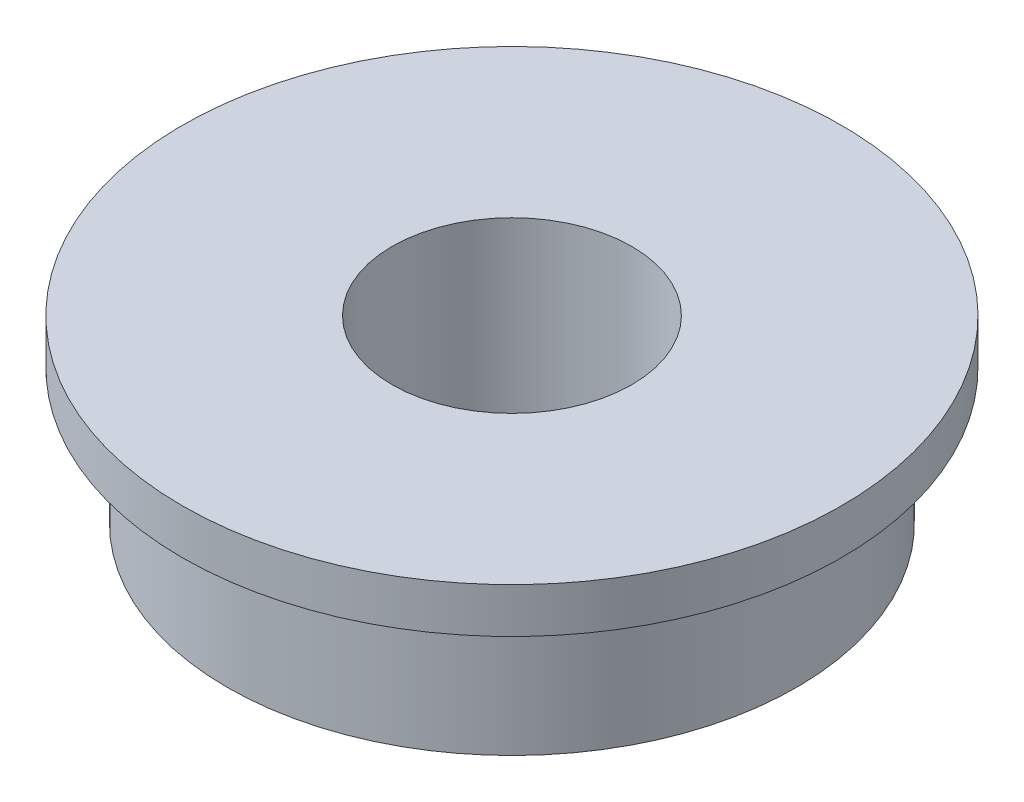
ISO-10303-21;
HEADER;
FILE_DESCRIPTION(('STEP AP214'),'2;1');
FILE_NAME('part.step','',(''),(''),'','','');
FILE_SCHEMA(('AUTOMOTIVE_DESIGN { 1 0 10303 214 1 1 1 1 }'));
ENDSEC;
DATA;
#1=APPLICATION_CONTEXT('core data for automotive mechanical design processes');
#2=APPLICATION_PROTOCOL_DEFINITION('international standard','automotive_design',2000,#1);
#3=PRODUCT_CONTEXT('',#1,'mechanical');
#4=PRODUCT('Part','Part','',(#3));
#5=PRODUCT_RELATED_PRODUCT_CATEGORY('part','',(#4));
#6=PRODUCT_DEFINITION_FORMATION('','',#4);
#7=PRODUCT_DEFINITION_CONTEXT('part definition',#1,'design');
#8=PRODUCT_DEFINITION('design','',#6,#7);
#9=PRODUCT_DEFINITION_SHAPE('','',#8);
#10=(LENGTH_UNIT() NAMED_UNIT(*) SI_UNIT(.MILLI.,.METRE.));
#11=(NAMED_UNIT(*) PLANE_ANGLE_UNIT() SI_UNIT($,.RADIAN.));
#12=(NAMED_UNIT(*) SI_UNIT($,.STERADIAN.) SOLID_ANGLE_UNIT());
#13=UNCERTAINTY_MEASURE_WITH_UNIT(LENGTH_MEASURE(1.E-05),#10,'distance_accuracy_value','');
#14=(GEOMETRIC_REPRESENTATION_CONTEXT(3) GLOBAL_UNCERTAINTY_ASSIGNED_CONTEXT((#13)) GLOBAL_UNIT_ASSIGNED_CONTEXT((#10,
#11,#12)) REPRESENTATION_CONTEXT('',''));
#15=CARTESIAN_POINT('',(0.,0.,0.));
#16=DIRECTION('',(0.,0.,1.));
#17=DIRECTION('',(1.,0.,0.));
#18=AXIS2_PLACEMENT_3D('',#15,#16,#17);
#19=CARTESIAN_POINT('',(0.,4.5,0.));
#20=DIRECTION('',(0.,-1.,0.));
#21=DIRECTION('',(0.,0.,-1.));
#22=AXIS2_PLACEMENT_3D('',#19,#20,#21);
#23=CYLINDRICAL_SURFACE('',#22,9.5);
#24=CARTESIAN_POINT('',(0.,4.5,0.));
#25=DIRECTION('',(0.,1.,0.));
#26=DIRECTION('',(0.,0.,1.));
#27=AXIS2_PLACEMENT_3D('',#24,#25,#26);
#28=CIRCLE('',#27,9.5);
#29=CARTESIAN_POINT('',(0.,4.5,9.50000000000003));
#30=VERTEX_POINT('',#29);
#31=EDGE_CURVE('E10',#30,#30,#28,.T.);
#32=ORIENTED_EDGE('',*,*,#31,.F.);
#33=EDGE_LOOP('',(#32));
#34=FACE_BOUND('',#33,.T.);
#35=CARTESIAN_POINT('',(0.,0.,0.));
#36=DIRECTION('',(0.,1.,0.));
#37=DIRECTION('',(0.,0.,1.));
#38=AXIS2_PLACEMENT_3D('',#35,#36,#37);
#39=CIRCLE('',#38,9.5);
#40=CARTESIAN_POINT('',(0.,0.,9.5));
#41=VERTEX_POINT('',#40);
#42=EDGE_CURVE('E35',#41,#41,#39,.T.);
#43=ORIENTED_EDGE('',*,*,#42,.T.);
#44=EDGE_LOOP('',(#43));
#45=FACE_BOUND('',#44,.T.);
#46=ADVANCED_FACE('F32',(#34,#45),#23,.T.);
#47=CARTESIAN_POINT('',(0.,0.,0.));
#48=DIRECTION('',(0.,1.,0.));
#49=DIRECTION('',(0.,0.,1.));
#50=AXIS2_PLACEMENT_3D('',#47,#48,#49);
#51=PLANE('',#50);
#52=CARTESIAN_POINT('',(0.,0.,0.));
#53=DIRECTION('',(0.,1.,0.));
#54=DIRECTION('',(0.,0.,1.));
#55=AXIS2_PLACEMENT_3D('',#52,#53,#54);
#56=CIRCLE('',#55,4.);
#57=CARTESIAN_POINT('',(0.,0.,4.));
#58=VERTEX_POINT('',#57);
#59=EDGE_CURVE('E47',#58,#58,#56,.T.);
#60=ORIENTED_EDGE('',*,*,#59,.T.);
#61=EDGE_LOOP('',(#60));
#62=FACE_BOUND('',#61,.T.);
#63=ORIENTED_EDGE('',*,*,#42,.F.);
#64=EDGE_LOOP('',(#63));
#65=FACE_BOUND('',#64,.T.);
#66=ADVANCED_FACE('F56',(#62,#65),#51,.F.);
#67=CARTESIAN_POINT('',(0.,4.5,0.));
#68=DIRECTION('',(0.,1.,0.));
#69=DIRECTION('',(0.,0.,1.));
#70=AXIS2_PLACEMENT_3D('',#67,#68,#69);
#71=PLANE('',#70);
#72=CARTESIAN_POINT('',(0.,4.5,0.));
#73=DIRECTION('',(0.,1.,0.));
#74=DIRECTION('',(0.,0.,1.));
#75=AXIS2_PLACEMENT_3D('',#72,#73,#74);
#76=CIRCLE('',#75,11.);
#77=CARTESIAN_POINT('',(0.,4.5,11.));
#78=VERTEX_POINT('',#77);
#79=EDGE_CURVE('E44',#78,#78,#76,.T.);
#80=ORIENTED_EDGE('',*,*,#79,.F.);
#81=EDGE_LOOP('',(#80));
#82=FACE_BOUND('',#81,.T.);
#83=ORIENTED_EDGE('',*,*,#31,.T.);
#84=EDGE_LOOP('',(#83));
#85=FACE_BOUND('',#84,.T.);
#86=ADVANCED_FACE('F74',(#82,#85),#71,.F.);
#87=CARTESIAN_POINT('',(0.,6.00000000000001,0.));
#88=DIRECTION('',(0.,-1.,0.));
#89=DIRECTION('',(0.,0.,-1.));
#90=AXIS2_PLACEMENT_3D('',#87,#88,#89);
#91=CYLINDRICAL_SURFACE('',#90,11.);
#92=CARTESIAN_POINT('',(0.,6.00000000000001,0.));
#93=DIRECTION('',(0.,1.,0.));
#94=DIRECTION('',(0.,0.,1.));
#95=AXIS2_PLACEMENT_3D('',#92,#93,#94);
#96=CIRCLE('',#95,11.);
#97=CARTESIAN_POINT('',(0.,6.00000000000001,11.));
#98=VERTEX_POINT('',#97);
#99=EDGE_CURVE('E42',#98,#98,#96,.T.);
#100=ORIENTED_EDGE('',*,*,#99,.F.);
#101=EDGE_LOOP('',(#100));
#102=FACE_BOUND('',#101,.T.);
#103=ORIENTED_EDGE('',*,*,#79,.T.);
#104=EDGE_LOOP('',(#103));
#105=FACE_BOUND('',#104,.T.);
#106=ADVANCED_FACE('F68',(#102,#105),#91,.T.);
#107=CARTESIAN_POINT('',(0.,6.00000000000001,0.));
#108=DIRECTION('',(0.,1.,0.));
#109=DIRECTION('',(0.,0.,1.));
#110=AXIS2_PLACEMENT_3D('',#107,#108,#109);
#111=PLANE('',#110);
#112=CARTESIAN_POINT('',(0.,6.00000000000001,0.));
#113=DIRECTION('',(0.,1.,0.));
#114=DIRECTION('',(0.,0.,1.));
#115=AXIS2_PLACEMENT_3D('',#112,#113,#114);
#116=CIRCLE('',#115,4.);
#117=CARTESIAN_POINT('',(0.,6.00000000000001,4.00000000000003));
#118=VERTEX_POINT('',#117);
#119=EDGE_CURVE('E50',#118,#118,#116,.T.);
#120=ORIENTED_EDGE('',*,*,#119,.F.);
#121=EDGE_LOOP('',(#120));
#122=FACE_BOUND('',#121,.T.);
#123=ORIENTED_EDGE('',*,*,#99,.T.);
#124=EDGE_LOOP('',(#123));
#125=FACE_BOUND('',#124,.T.);
#126=ADVANCED_FACE('F62',(#122,#125),#111,.T.);
#127=CARTESIAN_POINT('',(0.,0.,0.));
#128=DIRECTION('',(0.,1.,0.));
#129=DIRECTION('',(0.,0.,1.));
#130=AXIS2_PLACEMENT_3D('',#127,#128,#129);
#131=CYLINDRICAL_SURFACE('',#130,4.);
#132=ORIENTED_EDGE('',*,*,#59,.F.);
#133=EDGE_LOOP('',(#132));
#134=FACE_BOUND('',#133,.T.);
#135=ORIENTED_EDGE('',*,*,#119,.T.);
#136=EDGE_LOOP('',(#135));
#137=FACE_BOUND('',#136,.T.);
#138=ADVANCED_FACE('F59',(#134,#137),#131,.F.);
#139=CLOSED_SHELL('',(#46,#66,#86,#106,#126,#138));
#140=MANIFOLD_SOLID_BREP('B2',#139);
#141=ADVANCED_BREP_SHAPE_REPRESENTATION('',(#18,#140),#14);
#142=SHAPE_DEFINITION_REPRESENTATION(#9,#141);
ENDSEC;
END-ISO-10303-21;
